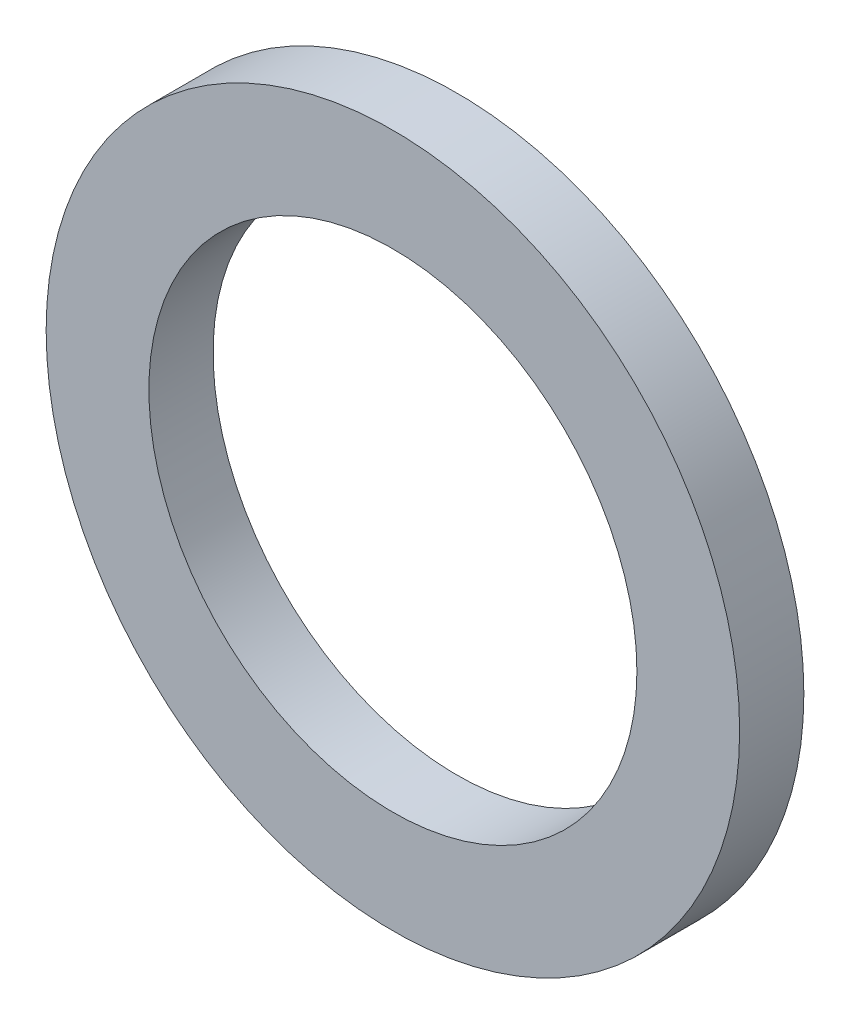
ISO-10303-21;
HEADER;
FILE_DESCRIPTION(('STEP AP214'),'2;1');
FILE_NAME('part.step','',(''),(''),'','','');
FILE_SCHEMA(('AUTOMOTIVE_DESIGN { 1 0 10303 214 1 1 1 1 }'));
ENDSEC;
DATA;
#1=APPLICATION_CONTEXT('core data for automotive mechanical design processes');
#2=APPLICATION_PROTOCOL_DEFINITION('international standard','automotive_design',2000,#1);
#3=PRODUCT_CONTEXT('',#1,'mechanical');
#4=PRODUCT('Part','Part','',(#3));
#5=PRODUCT_RELATED_PRODUCT_CATEGORY('part','',(#4));
#6=PRODUCT_DEFINITION_FORMATION('','',#4);
#7=PRODUCT_DEFINITION_CONTEXT('part definition',#1,'design');
#8=PRODUCT_DEFINITION('design','',#6,#7);
#9=PRODUCT_DEFINITION_SHAPE('','',#8);
#10=(LENGTH_UNIT() NAMED_UNIT(*) SI_UNIT(.MILLI.,.METRE.));
#11=(NAMED_UNIT(*) PLANE_ANGLE_UNIT() SI_UNIT($,.RADIAN.));
#12=(NAMED_UNIT(*) SI_UNIT($,.STERADIAN.) SOLID_ANGLE_UNIT());
#13=UNCERTAINTY_MEASURE_WITH_UNIT(LENGTH_MEASURE(1.E-05),#10,'distance_accuracy_value','');
#14=(GEOMETRIC_REPRESENTATION_CONTEXT(3) GLOBAL_UNCERTAINTY_ASSIGNED_CONTEXT((#13)) GLOBAL_UNIT_ASSIGNED_CONTEXT((#10,
#11,#12)) REPRESENTATION_CONTEXT('',''));
#15=CARTESIAN_POINT('',(0.,0.,0.));
#16=DIRECTION('',(0.,0.,1.));
#17=DIRECTION('',(1.,0.,0.));
#18=AXIS2_PLACEMENT_3D('',#15,#16,#17);
#19=CARTESIAN_POINT('',(0.,0.,5.));
#20=DIRECTION('',(0.,0.,1.));
#21=DIRECTION('',(1.,0.,0.));
#22=AXIS2_PLACEMENT_3D('',#19,#20,#21);
#23=PLANE('',#22);
#24=CARTESIAN_POINT('',(0.,0.,5.));
#25=DIRECTION('',(0.,0.,1.));
#26=DIRECTION('',(1.,0.,0.));
#27=AXIS2_PLACEMENT_3D('',#24,#25,#26);
#28=CIRCLE('',#27,27.);
#29=CARTESIAN_POINT('',(27.,0.,5.));
#30=VERTEX_POINT('',#29);
#31=EDGE_CURVE('E10',#30,#30,#28,.T.);
#32=ORIENTED_EDGE('',*,*,#31,.T.);
#33=EDGE_LOOP('',(#32));
#34=FACE_BOUND('',#33,.T.);
#35=CARTESIAN_POINT('',(0.,0.,5.));
#36=DIRECTION('',(0.,0.,1.));
#37=DIRECTION('',(1.,0.,0.));
#38=AXIS2_PLACEMENT_3D('',#35,#36,#37);
#39=CIRCLE('',#38,19.);
#40=CARTESIAN_POINT('',(19.,0.,5.));
#41=VERTEX_POINT('',#40);
#42=EDGE_CURVE('E56',#41,#41,#39,.T.);
#43=ORIENTED_EDGE('',*,*,#42,.F.);
#44=EDGE_LOOP('',(#43));
#45=FACE_BOUND('',#44,.T.);
#46=ADVANCED_FACE('F43',(#34,#45),#23,.T.);
#47=CARTESIAN_POINT('',(0.,0.,0.));
#48=DIRECTION('',(0.,0.,1.));
#49=DIRECTION('',(1.,0.,0.));
#50=AXIS2_PLACEMENT_3D('',#47,#48,#49);
#51=PLANE('',#50);
#52=CARTESIAN_POINT('',(0.,0.,0.));
#53=DIRECTION('',(0.,0.,1.));
#54=DIRECTION('',(1.,0.,0.));
#55=AXIS2_PLACEMENT_3D('',#52,#53,#54);
#56=CIRCLE('',#55,27.);
#57=CARTESIAN_POINT('',(27.,0.,0.));
#58=VERTEX_POINT('',#57);
#59=EDGE_CURVE('E47',#58,#58,#56,.T.);
#60=ORIENTED_EDGE('',*,*,#59,.F.);
#61=EDGE_LOOP('',(#60));
#62=FACE_BOUND('',#61,.T.);
#63=CARTESIAN_POINT('',(0.,0.,0.));
#64=DIRECTION('',(0.,0.,1.));
#65=DIRECTION('',(1.,0.,0.));
#66=AXIS2_PLACEMENT_3D('',#63,#64,#65);
#67=CIRCLE('',#66,19.);
#68=CARTESIAN_POINT('',(19.,0.,0.));
#69=VERTEX_POINT('',#68);
#70=EDGE_CURVE('E58',#69,#69,#67,.T.);
#71=ORIENTED_EDGE('',*,*,#70,.T.);
#72=EDGE_LOOP('',(#71));
#73=FACE_BOUND('',#72,.T.);
#74=ADVANCED_FACE('F70',(#62,#73),#51,.F.);
#75=CARTESIAN_POINT('',(0.,0.,5.));
#76=DIRECTION('',(0.,0.,-1.));
#77=DIRECTION('',(-1.,0.,0.));
#78=AXIS2_PLACEMENT_3D('',#75,#76,#77);
#79=CYLINDRICAL_SURFACE('',#78,27.);
#80=ORIENTED_EDGE('',*,*,#31,.F.);
#81=EDGE_LOOP('',(#80));
#82=FACE_BOUND('',#81,.T.);
#83=ORIENTED_EDGE('',*,*,#59,.T.);
#84=EDGE_LOOP('',(#83));
#85=FACE_BOUND('',#84,.T.);
#86=ADVANCED_FACE('F45',(#82,#85),#79,.T.);
#87=CARTESIAN_POINT('',(0.,0.,5.));
#88=DIRECTION('',(0.,0.,-1.));
#89=DIRECTION('',(-1.,0.,0.));
#90=AXIS2_PLACEMENT_3D('',#87,#88,#89);
#91=CYLINDRICAL_SURFACE('',#90,19.);
#92=ORIENTED_EDGE('',*,*,#42,.T.);
#93=EDGE_LOOP('',(#92));
#94=FACE_BOUND('',#93,.T.);
#95=ORIENTED_EDGE('',*,*,#70,.F.);
#96=EDGE_LOOP('',(#95));
#97=FACE_BOUND('',#96,.T.);
#98=ADVANCED_FACE('F66',(#94,#97),#91,.F.);
#99=CLOSED_SHELL('',(#46,#74,#86,#98));
#100=MANIFOLD_SOLID_BREP('B2',#99);
#101=ADVANCED_BREP_SHAPE_REPRESENTATION('',(#18,#100),#14);
#102=SHAPE_DEFINITION_REPRESENTATION(#9,#101);
ENDSEC;
END-ISO-10303-21;
